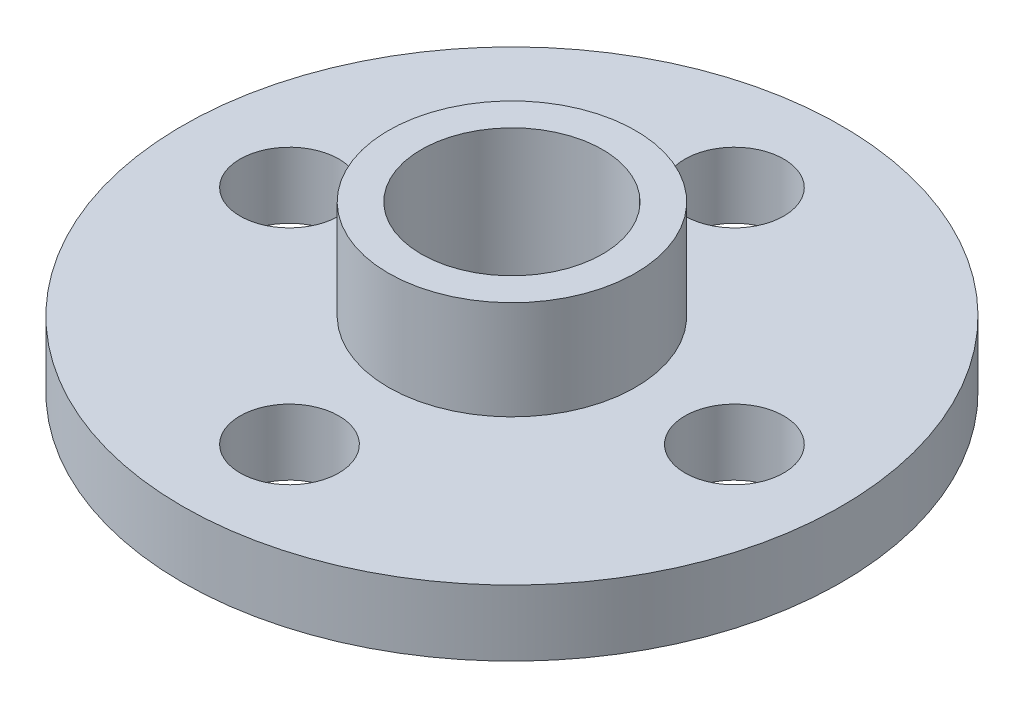
ISO-10303-21;
HEADER;
FILE_DESCRIPTION(('STEP AP214'),'2;1');
FILE_NAME('part.step','',(''),(''),'','','');
FILE_SCHEMA(('AUTOMOTIVE_DESIGN { 1 0 10303 214 1 1 1 1 }'));
ENDSEC;
DATA;
#1=APPLICATION_CONTEXT('core data for automotive mechanical design processes');
#2=APPLICATION_PROTOCOL_DEFINITION('international standard','automotive_design',2000,#1);
#3=PRODUCT_CONTEXT('',#1,'mechanical');
#4=PRODUCT('Part','Part','',(#3));
#5=PRODUCT_RELATED_PRODUCT_CATEGORY('part','',(#4));
#6=PRODUCT_DEFINITION_FORMATION('','',#4);
#7=PRODUCT_DEFINITION_CONTEXT('part definition',#1,'design');
#8=PRODUCT_DEFINITION('design','',#6,#7);
#9=PRODUCT_DEFINITION_SHAPE('','',#8);
#10=(LENGTH_UNIT() NAMED_UNIT(*) SI_UNIT(.MILLI.,.METRE.));
#11=(NAMED_UNIT(*) PLANE_ANGLE_UNIT() SI_UNIT($,.RADIAN.));
#12=(NAMED_UNIT(*) SI_UNIT($,.STERADIAN.) SOLID_ANGLE_UNIT());
#13=UNCERTAINTY_MEASURE_WITH_UNIT(LENGTH_MEASURE(1.E-05),#10,'distance_accuracy_value','');
#14=(GEOMETRIC_REPRESENTATION_CONTEXT(3) GLOBAL_UNCERTAINTY_ASSIGNED_CONTEXT((#13)) GLOBAL_UNIT_ASSIGNED_CONTEXT((#10,
#11,#12)) REPRESENTATION_CONTEXT('',''));
#15=CARTESIAN_POINT('',(0.,0.,0.));
#16=DIRECTION('',(0.,0.,1.));
#17=DIRECTION('',(1.,0.,0.));
#18=AXIS2_PLACEMENT_3D('',#15,#16,#17);
#19=CARTESIAN_POINT('',(0.,0.,0.));
#20=DIRECTION('',(0.,1.,0.));
#21=DIRECTION('',(0.,0.,1.));
#22=AXIS2_PLACEMENT_3D('',#19,#20,#21);
#23=CYLINDRICAL_SURFACE('',#22,1.5);
#24=CARTESIAN_POINT('',(0.,0.,0.));
#25=DIRECTION('',(0.,1.,0.));
#26=DIRECTION('',(0.,0.,1.));
#27=AXIS2_PLACEMENT_3D('',#24,#25,#26);
#28=CIRCLE('',#27,1.5);
#29=CARTESIAN_POINT('',(0.,0.,1.5));
#30=VERTEX_POINT('',#29);
#31=EDGE_CURVE('E81',#30,#30,#28,.T.);
#32=ORIENTED_EDGE('',*,*,#31,.F.);
#33=EDGE_LOOP('',(#32));
#34=FACE_BOUND('',#33,.T.);
#35=CARTESIAN_POINT('',(0.,0.5,0.));
#36=DIRECTION('',(0.,1.,0.));
#37=DIRECTION('',(0.,0.,1.));
#38=AXIS2_PLACEMENT_3D('',#35,#36,#37);
#39=CIRCLE('',#38,1.5);
#40=CARTESIAN_POINT('',(0.,0.5,1.5));
#41=VERTEX_POINT('',#40);
#42=EDGE_CURVE('E43',#41,#41,#39,.F.);
#43=ORIENTED_EDGE('',*,*,#42,.F.);
#44=EDGE_LOOP('',(#43));
#45=FACE_BOUND('',#44,.T.);
#46=ADVANCED_FACE('F39',(#34,#45),#23,.F.);
#47=CARTESIAN_POINT('',(0.,2.,0.));
#48=DIRECTION('',(0.,-1.,0.));
#49=DIRECTION('',(0.,0.,-1.));
#50=AXIS2_PLACEMENT_3D('',#47,#48,#49);
#51=CYLINDRICAL_SURFACE('',#50,10.);
#52=CARTESIAN_POINT('',(0.,2.,0.));
#53=DIRECTION('',(0.,1.,0.));
#54=DIRECTION('',(0.,0.,1.));
#55=AXIS2_PLACEMENT_3D('',#52,#53,#54);
#56=CIRCLE('',#55,10.);
#57=CARTESIAN_POINT('',(0.,2.,10.));
#58=VERTEX_POINT('',#57);
#59=EDGE_CURVE('E10',#58,#58,#56,.T.);
#60=ORIENTED_EDGE('',*,*,#59,.F.);
#61=EDGE_LOOP('',(#60));
#62=FACE_BOUND('',#61,.T.);
#63=CARTESIAN_POINT('',(0.,0.,0.));
#64=DIRECTION('',(0.,1.,0.));
#65=DIRECTION('',(0.,0.,1.));
#66=AXIS2_PLACEMENT_3D('',#63,#64,#65);
#67=CIRCLE('',#66,10.);
#68=CARTESIAN_POINT('',(0.,0.,10.));
#69=VERTEX_POINT('',#68);
#70=EDGE_CURVE('E47',#69,#69,#67,.T.);
#71=ORIENTED_EDGE('',*,*,#70,.T.);
#72=EDGE_LOOP('',(#71));
#73=FACE_BOUND('',#72,.T.);
#74=ADVANCED_FACE('F41',(#62,#73),#51,.T.);
#75=CARTESIAN_POINT('',(0.,2.,0.));
#76=DIRECTION('',(0.,1.,0.));
#77=DIRECTION('',(0.,0.,1.));
#78=AXIS2_PLACEMENT_3D('',#75,#76,#77);
#79=PLANE('',#78);
#80=CARTESIAN_POINT('',(0.,2.,0.));
#81=DIRECTION('',(0.,1.,0.));
#82=DIRECTION('',(0.,0.,1.));
#83=AXIS2_PLACEMENT_3D('',#80,#81,#82);
#84=CIRCLE('',#83,3.75);
#85=CARTESIAN_POINT('',(0.,2.,3.75));
#86=VERTEX_POINT('',#85);
#87=EDGE_CURVE('E78',#86,#86,#84,.T.);
#88=ORIENTED_EDGE('',*,*,#87,.F.);
#89=EDGE_LOOP('',(#88));
#90=FACE_BOUND('',#89,.T.);
#91=CARTESIAN_POINT('',(0.,2.,-6.75));
#92=DIRECTION('',(0.,1.,0.));
#93=DIRECTION('',(0.,0.,1.));
#94=AXIS2_PLACEMENT_3D('',#91,#92,#93);
#95=CIRCLE('',#94,1.5);
#96=CARTESIAN_POINT('',(0.,2.,-5.25));
#97=VERTEX_POINT('',#96);
#98=EDGE_CURVE('E73',#97,#97,#95,.T.);
#99=ORIENTED_EDGE('',*,*,#98,.F.);
#100=EDGE_LOOP('',(#99));
#101=FACE_BOUND('',#100,.T.);
#102=CARTESIAN_POINT('',(6.75,2.,0.));
#103=DIRECTION('',(0.,1.,0.));
#104=DIRECTION('',(0.,0.,1.));
#105=AXIS2_PLACEMENT_3D('',#102,#103,#104);
#106=CIRCLE('',#105,1.5);
#107=CARTESIAN_POINT('',(6.75,2.,1.5));
#108=VERTEX_POINT('',#107);
#109=EDGE_CURVE('E67',#108,#108,#106,.T.);
#110=ORIENTED_EDGE('',*,*,#109,.F.);
#111=EDGE_LOOP('',(#110));
#112=FACE_BOUND('',#111,.T.);
#113=CARTESIAN_POINT('',(0.,2.,6.75));
#114=DIRECTION('',(0.,1.,0.));
#115=DIRECTION('',(0.,0.,-1.));
#116=AXIS2_PLACEMENT_3D('',#113,#114,#115);
#117=CIRCLE('',#116,1.5);
#118=CARTESIAN_POINT('',(0.,2.,5.25));
#119=VERTEX_POINT('',#118);
#120=EDGE_CURVE('E61',#119,#119,#117,.T.);
#121=ORIENTED_EDGE('',*,*,#120,.F.);
#122=EDGE_LOOP('',(#121));
#123=FACE_BOUND('',#122,.T.);
#124=CARTESIAN_POINT('',(-6.75,2.,0.));
#125=DIRECTION('',(0.,1.,0.));
#126=DIRECTION('',(0.,0.,-1.));
#127=AXIS2_PLACEMENT_3D('',#124,#125,#126);
#128=CIRCLE('',#127,1.5);
#129=CARTESIAN_POINT('',(-6.75,2.,-1.5));
#130=VERTEX_POINT('',#129);
#131=EDGE_CURVE('E54',#130,#130,#128,.T.);
#132=ORIENTED_EDGE('',*,*,#131,.F.);
#133=EDGE_LOOP('',(#132));
#134=FACE_BOUND('',#133,.T.);
#135=ORIENTED_EDGE('',*,*,#59,.T.);
#136=EDGE_LOOP('',(#135));
#137=FACE_BOUND('',#136,.T.);
#138=ADVANCED_FACE('F106',(#90,#101,#112,#123,#134,#137),#79,.T.);
#139=CARTESIAN_POINT('',(0.,0.,0.));
#140=DIRECTION('',(0.,1.,0.));
#141=DIRECTION('',(0.,0.,1.));
#142=AXIS2_PLACEMENT_3D('',#139,#140,#141);
#143=PLANE('',#142);
#144=ORIENTED_EDGE('',*,*,#31,.T.);
#145=EDGE_LOOP('',(#144));
#146=FACE_BOUND('',#145,.T.);
#147=CARTESIAN_POINT('',(0.,0.,-6.75));
#148=DIRECTION('',(0.,1.,0.));
#149=DIRECTION('',(0.,0.,1.));
#150=AXIS2_PLACEMENT_3D('',#147,#148,#149);
#151=CIRCLE('',#150,1.5);
#152=CARTESIAN_POINT('',(0.,0.,-5.25));
#153=VERTEX_POINT('',#152);
#154=EDGE_CURVE('E52',#153,#153,#151,.T.);
#155=ORIENTED_EDGE('',*,*,#154,.T.);
#156=EDGE_LOOP('',(#155));
#157=FACE_BOUND('',#156,.T.);
#158=CARTESIAN_POINT('',(6.75,0.,0.));
#159=DIRECTION('',(0.,1.,0.));
#160=DIRECTION('',(0.,0.,1.));
#161=AXIS2_PLACEMENT_3D('',#158,#159,#160);
#162=CIRCLE('',#161,1.5);
#163=CARTESIAN_POINT('',(6.75,0.,1.5));
#164=VERTEX_POINT('',#163);
#165=EDGE_CURVE('E70',#164,#164,#162,.T.);
#166=ORIENTED_EDGE('',*,*,#165,.T.);
#167=EDGE_LOOP('',(#166));
#168=FACE_BOUND('',#167,.T.);
#169=CARTESIAN_POINT('',(0.,0.,6.75));
#170=DIRECTION('',(0.,1.,0.));
#171=DIRECTION('',(0.,0.,-1.));
#172=AXIS2_PLACEMENT_3D('',#169,#170,#171);
#173=CIRCLE('',#172,1.5);
#174=CARTESIAN_POINT('',(0.,0.,5.25));
#175=VERTEX_POINT('',#174);
#176=EDGE_CURVE('E64',#175,#175,#173,.T.);
#177=ORIENTED_EDGE('',*,*,#176,.T.);
#178=EDGE_LOOP('',(#177));
#179=FACE_BOUND('',#178,.T.);
#180=CARTESIAN_POINT('',(-6.75,0.,0.));
#181=DIRECTION('',(0.,1.,0.));
#182=DIRECTION('',(0.,0.,-1.));
#183=AXIS2_PLACEMENT_3D('',#180,#181,#182);
#184=CIRCLE('',#183,1.5);
#185=CARTESIAN_POINT('',(-6.75,0.,-1.5));
#186=VERTEX_POINT('',#185);
#187=EDGE_CURVE('E57',#186,#186,#184,.T.);
#188=ORIENTED_EDGE('',*,*,#187,.T.);
#189=EDGE_LOOP('',(#188));
#190=FACE_BOUND('',#189,.T.);
#191=ORIENTED_EDGE('',*,*,#70,.F.);
#192=EDGE_LOOP('',(#191));
#193=FACE_BOUND('',#192,.T.);
#194=ADVANCED_FACE('F135',(#146,#157,#168,#179,#190,#193),#143,.F.);
#195=CARTESIAN_POINT('',(-6.75,0.,0.));
#196=DIRECTION('',(0.,1.,0.));
#197=DIRECTION('',(0.,0.,1.));
#198=AXIS2_PLACEMENT_3D('',#195,#196,#197);
#199=CYLINDRICAL_SURFACE('',#198,1.5);
#200=ORIENTED_EDGE('',*,*,#187,.F.);
#201=EDGE_LOOP('',(#200));
#202=FACE_BOUND('',#201,.T.);
#203=ORIENTED_EDGE('',*,*,#131,.T.);
#204=EDGE_LOOP('',(#203));
#205=FACE_BOUND('',#204,.T.);
#206=ADVANCED_FACE('F131',(#202,#205),#199,.F.);
#207=CARTESIAN_POINT('',(0.,0.,6.75));
#208=DIRECTION('',(0.,1.,0.));
#209=DIRECTION('',(0.,0.,1.));
#210=AXIS2_PLACEMENT_3D('',#207,#208,#209);
#211=CYLINDRICAL_SURFACE('',#210,1.5);
#212=ORIENTED_EDGE('',*,*,#176,.F.);
#213=EDGE_LOOP('',(#212));
#214=FACE_BOUND('',#213,.T.);
#215=ORIENTED_EDGE('',*,*,#120,.T.);
#216=EDGE_LOOP('',(#215));
#217=FACE_BOUND('',#216,.T.);
#218=ADVANCED_FACE('F127',(#214,#217),#211,.F.);
#219=CARTESIAN_POINT('',(6.75,0.,0.));
#220=DIRECTION('',(0.,1.,0.));
#221=DIRECTION('',(0.,0.,1.));
#222=AXIS2_PLACEMENT_3D('',#219,#220,#221);
#223=CYLINDRICAL_SURFACE('',#222,1.5);
#224=ORIENTED_EDGE('',*,*,#165,.F.);
#225=EDGE_LOOP('',(#224));
#226=FACE_BOUND('',#225,.T.);
#227=ORIENTED_EDGE('',*,*,#109,.T.);
#228=EDGE_LOOP('',(#227));
#229=FACE_BOUND('',#228,.T.);
#230=ADVANCED_FACE('F123',(#226,#229),#223,.F.);
#231=CARTESIAN_POINT('',(0.,0.,-6.75));
#232=DIRECTION('',(0.,1.,0.));
#233=DIRECTION('',(0.,0.,1.));
#234=AXIS2_PLACEMENT_3D('',#231,#232,#233);
#235=CYLINDRICAL_SURFACE('',#234,1.5);
#236=ORIENTED_EDGE('',*,*,#154,.F.);
#237=EDGE_LOOP('',(#236));
#238=FACE_BOUND('',#237,.T.);
#239=ORIENTED_EDGE('',*,*,#98,.T.);
#240=EDGE_LOOP('',(#239));
#241=FACE_BOUND('',#240,.T.);
#242=ADVANCED_FACE('F119',(#238,#241),#235,.F.);
#243=CARTESIAN_POINT('',(0.,5.,0.));
#244=DIRECTION('',(0.,-1.,0.));
#245=DIRECTION('',(0.,0.,-1.));
#246=AXIS2_PLACEMENT_3D('',#243,#244,#245);
#247=CYLINDRICAL_SURFACE('',#246,3.75);
#248=CARTESIAN_POINT('',(0.,5.,0.));
#249=DIRECTION('',(0.,1.,0.));
#250=DIRECTION('',(0.,0.,1.));
#251=AXIS2_PLACEMENT_3D('',#248,#249,#250);
#252=CIRCLE('',#251,3.75);
#253=CARTESIAN_POINT('',(0.,5.,3.75));
#254=VERTEX_POINT('',#253);
#255=EDGE_CURVE('E58',#254,#254,#252,.T.);
#256=ORIENTED_EDGE('',*,*,#255,.F.);
#257=EDGE_LOOP('',(#256));
#258=FACE_BOUND('',#257,.T.);
#259=ORIENTED_EDGE('',*,*,#87,.T.);
#260=EDGE_LOOP('',(#259));
#261=FACE_BOUND('',#260,.T.);
#262=ADVANCED_FACE('F115',(#258,#261),#247,.T.);
#263=CARTESIAN_POINT('',(0.,5.,0.));
#264=DIRECTION('',(0.,1.,0.));
#265=DIRECTION('',(0.,0.,1.));
#266=AXIS2_PLACEMENT_3D('',#263,#264,#265);
#267=PLANE('',#266);
#268=CARTESIAN_POINT('',(0.,5.,0.));
#269=DIRECTION('',(0.,1.,0.));
#270=DIRECTION('',(0.,0.,1.));
#271=AXIS2_PLACEMENT_3D('',#268,#269,#270);
#272=CIRCLE('',#271,2.75);
#273=CARTESIAN_POINT('',(0.,5.,2.75));
#274=VERTEX_POINT('',#273);
#275=EDGE_CURVE('E86',#274,#274,#272,.T.);
#276=ORIENTED_EDGE('',*,*,#275,.F.);
#277=EDGE_LOOP('',(#276));
#278=FACE_BOUND('',#277,.T.);
#279=ORIENTED_EDGE('',*,*,#255,.T.);
#280=EDGE_LOOP('',(#279));
#281=FACE_BOUND('',#280,.T.);
#282=ADVANCED_FACE('F113',(#278,#281),#267,.T.);
#283=CARTESIAN_POINT('',(0.,0.5,0.));
#284=DIRECTION('',(0.,1.,0.));
#285=DIRECTION('',(0.,0.,1.));
#286=AXIS2_PLACEMENT_3D('',#283,#284,#285);
#287=PLANE('',#286);
#288=CARTESIAN_POINT('',(0.,0.5,0.));
#289=DIRECTION('',(0.,1.,0.));
#290=DIRECTION('',(0.,0.,1.));
#291=AXIS2_PLACEMENT_3D('',#288,#289,#290);
#292=CIRCLE('',#291,2.75);
#293=CARTESIAN_POINT('',(0.,0.5,2.75));
#294=VERTEX_POINT('',#293);
#295=EDGE_CURVE('E89',#294,#294,#292,.T.);
#296=ORIENTED_EDGE('',*,*,#295,.T.);
#297=EDGE_LOOP('',(#296));
#298=FACE_BOUND('',#297,.T.);
#299=ORIENTED_EDGE('',*,*,#42,.T.);
#300=EDGE_LOOP('',(#299));
#301=FACE_BOUND('',#300,.T.);
#302=ADVANCED_FACE('F96',(#298,#301),#287,.T.);
#303=CARTESIAN_POINT('',(0.,0.5,0.));
#304=DIRECTION('',(0.,1.,0.));
#305=DIRECTION('',(0.,0.,1.));
#306=AXIS2_PLACEMENT_3D('',#303,#304,#305);
#307=CYLINDRICAL_SURFACE('',#306,2.75);
#308=ORIENTED_EDGE('',*,*,#295,.F.);
#309=EDGE_LOOP('',(#308));
#310=FACE_BOUND('',#309,.T.);
#311=ORIENTED_EDGE('',*,*,#275,.T.);
#312=EDGE_LOOP('',(#311));
#313=FACE_BOUND('',#312,.T.);
#314=ADVANCED_FACE('F111',(#310,#313),#307,.F.);
#315=CLOSED_SHELL('',(#46,#74,#138,#194,#206,#218,#230,#242,#262,#282,#302,#314));
#316=MANIFOLD_SOLID_BREP('B2',#315);
#317=ADVANCED_BREP_SHAPE_REPRESENTATION('',(#18,#316),#14);
#318=SHAPE_DEFINITION_REPRESENTATION(#9,#317);
ENDSEC;
END-ISO-10303-21;
